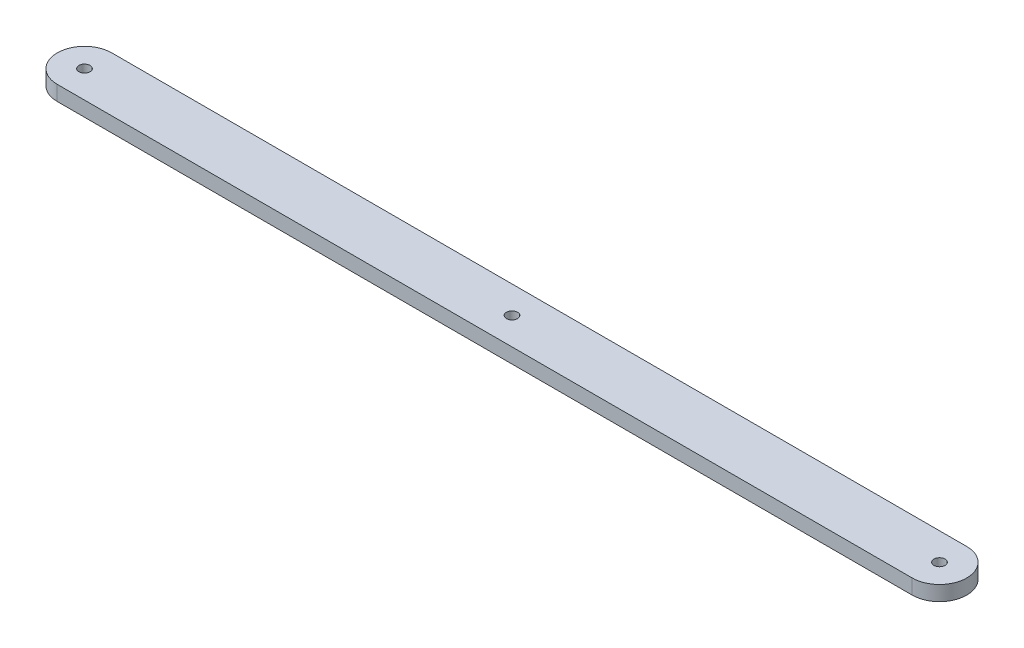
ISO-10303-21;
HEADER;
FILE_DESCRIPTION(('STEP AP214'),'2;1');
FILE_NAME('part.step','',(''),(''),'','','');
FILE_SCHEMA(('AUTOMOTIVE_DESIGN { 1 0 10303 214 1 1 1 1 }'));
ENDSEC;
DATA;
#1=APPLICATION_CONTEXT('core data for automotive mechanical design processes');
#2=APPLICATION_PROTOCOL_DEFINITION('international standard','automotive_design',2000,#1);
#3=PRODUCT_CONTEXT('',#1,'mechanical');
#4=PRODUCT('Part','Part','',(#3));
#5=PRODUCT_RELATED_PRODUCT_CATEGORY('part','',(#4));
#6=PRODUCT_DEFINITION_FORMATION('','',#4);
#7=PRODUCT_DEFINITION_CONTEXT('part definition',#1,'design');
#8=PRODUCT_DEFINITION('design','',#6,#7);
#9=PRODUCT_DEFINITION_SHAPE('','',#8);
#10=(LENGTH_UNIT() NAMED_UNIT(*) SI_UNIT(.MILLI.,.METRE.));
#11=(NAMED_UNIT(*) PLANE_ANGLE_UNIT() SI_UNIT($,.RADIAN.));
#12=(NAMED_UNIT(*) SI_UNIT($,.STERADIAN.) SOLID_ANGLE_UNIT());
#13=UNCERTAINTY_MEASURE_WITH_UNIT(LENGTH_MEASURE(1.E-05),#10,'distance_accuracy_value','');
#14=(GEOMETRIC_REPRESENTATION_CONTEXT(3) GLOBAL_UNCERTAINTY_ASSIGNED_CONTEXT((#13)) GLOBAL_UNIT_ASSIGNED_CONTEXT((#10,
#11,#12)) REPRESENTATION_CONTEXT('',''));
#15=CARTESIAN_POINT('',(0.,0.,0.));
#16=DIRECTION('',(0.,0.,1.));
#17=DIRECTION('',(1.,0.,0.));
#18=AXIS2_PLACEMENT_3D('',#15,#16,#17);
#19=CARTESIAN_POINT('',(0.,4.35,0.));
#20=DIRECTION('',(0.,1.,0.));
#21=DIRECTION('',(0.,0.,1.));
#22=AXIS2_PLACEMENT_3D('',#19,#20,#21);
#23=PLANE('',#22);
#24=CARTESIAN_POINT('',(125.,4.35,0.));
#25=DIRECTION('',(0.,1.,0.));
#26=DIRECTION('',(0.,0.,1.));
#27=AXIS2_PLACEMENT_3D('',#24,#25,#26);
#28=CIRCLE('',#27,1.625);
#29=CARTESIAN_POINT('',(125.,4.35,1.625));
#30=VERTEX_POINT('',#29);
#31=EDGE_CURVE('E117',#30,#30,#28,.T.);
#32=ORIENTED_EDGE('',*,*,#31,.F.);
#33=EDGE_LOOP('',(#32));
#34=FACE_BOUND('',#33,.T.);
#35=CARTESIAN_POINT('',(0.,4.35,0.));
#36=DIRECTION('',(0.,1.,0.));
#37=DIRECTION('',(0.,0.,1.));
#38=AXIS2_PLACEMENT_3D('',#35,#36,#37);
#39=CIRCLE('',#38,7.97347609683682);
#40=CARTESIAN_POINT('',(0.,4.35,-7.97347609683682));
#41=VERTEX_POINT('',#40);
#42=CARTESIAN_POINT('',(0.,4.35,7.97347609683682));
#43=VERTEX_POINT('',#42);
#44=EDGE_CURVE('E87',#41,#43,#39,.T.);
#45=ORIENTED_EDGE('',*,*,#44,.T.);
#46=DIRECTION('',(1.,0.,0.));
#47=VECTOR('',#46,1.);
#48=CARTESIAN_POINT('',(0.,4.35,7.97347609683682));
#49=LINE('',#48,#47);
#50=CARTESIAN_POINT('',(250.,4.35,7.97347609683682));
#51=VERTEX_POINT('',#50);
#52=EDGE_CURVE('E82',#43,#51,#49,.T.);
#53=ORIENTED_EDGE('',*,*,#52,.T.);
#54=CARTESIAN_POINT('',(250.,4.35,0.));
#55=DIRECTION('',(0.,1.,0.));
#56=DIRECTION('',(0.,0.,1.));
#57=AXIS2_PLACEMENT_3D('',#54,#55,#56);
#58=CIRCLE('',#57,7.97347609683682);
#59=CARTESIAN_POINT('',(250.,4.35,-7.97347609683682));
#60=VERTEX_POINT('',#59);
#61=EDGE_CURVE('E85',#51,#60,#58,.T.);
#62=ORIENTED_EDGE('',*,*,#61,.T.);
#63=DIRECTION('',(-1.,0.,0.));
#64=VECTOR('',#63,1.);
#65=CARTESIAN_POINT('',(0.,4.35,-7.97347609683682));
#66=LINE('',#65,#64);
#67=EDGE_CURVE('E52',#60,#41,#66,.T.);
#68=ORIENTED_EDGE('',*,*,#67,.T.);
#69=EDGE_LOOP('',(#45,#53,#62,#68));
#70=FACE_BOUND('',#69,.T.);
#71=CARTESIAN_POINT('',(250.,4.35,0.));
#72=DIRECTION('',(0.,1.,0.));
#73=DIRECTION('',(0.,0.,1.));
#74=AXIS2_PLACEMENT_3D('',#71,#72,#73);
#75=CIRCLE('',#74,1.62499999999998);
#76=CARTESIAN_POINT('',(250.,4.35,1.62499999999998));
#77=VERTEX_POINT('',#76);
#78=EDGE_CURVE('E102',#77,#77,#75,.T.);
#79=ORIENTED_EDGE('',*,*,#78,.F.);
#80=EDGE_LOOP('',(#79));
#81=FACE_BOUND('',#80,.T.);
#82=CARTESIAN_POINT('',(0.,4.35,0.));
#83=DIRECTION('',(0.,1.,0.));
#84=DIRECTION('',(0.,0.,1.));
#85=AXIS2_PLACEMENT_3D('',#82,#83,#84);
#86=CIRCLE('',#85,1.625);
#87=CARTESIAN_POINT('',(0.,4.35,1.625));
#88=VERTEX_POINT('',#87);
#89=EDGE_CURVE('E123',#88,#88,#86,.T.);
#90=ORIENTED_EDGE('',*,*,#89,.F.);
#91=EDGE_LOOP('',(#90));
#92=FACE_BOUND('',#91,.T.);
#93=ADVANCED_FACE('F35',(#34,#70,#81,#92),#23,.T.);
#94=CARTESIAN_POINT('',(0.,0.,0.));
#95=DIRECTION('',(0.,1.,0.));
#96=DIRECTION('',(0.,0.,1.));
#97=AXIS2_PLACEMENT_3D('',#94,#95,#96);
#98=PLANE('',#97);
#99=CARTESIAN_POINT('',(125.,0.,0.));
#100=DIRECTION('',(0.,1.,0.));
#101=DIRECTION('',(0.,0.,1.));
#102=AXIS2_PLACEMENT_3D('',#99,#100,#101);
#103=CIRCLE('',#102,1.625);
#104=CARTESIAN_POINT('',(125.,0.,1.625));
#105=VERTEX_POINT('',#104);
#106=EDGE_CURVE('E120',#105,#105,#103,.T.);
#107=ORIENTED_EDGE('',*,*,#106,.T.);
#108=EDGE_LOOP('',(#107));
#109=FACE_BOUND('',#108,.T.);
#110=CARTESIAN_POINT('',(0.,0.,0.));
#111=DIRECTION('',(0.,1.,0.));
#112=DIRECTION('',(0.,0.,1.));
#113=AXIS2_PLACEMENT_3D('',#110,#111,#112);
#114=CIRCLE('',#113,7.97347609683682);
#115=CARTESIAN_POINT('',(0.,0.,-7.97347609683682));
#116=VERTEX_POINT('',#115);
#117=CARTESIAN_POINT('',(0.,0.,7.97347609683682));
#118=VERTEX_POINT('',#117);
#119=EDGE_CURVE('E99',#116,#118,#114,.T.);
#120=ORIENTED_EDGE('',*,*,#119,.F.);
#121=DIRECTION('',(-1.,0.,0.));
#122=VECTOR('',#121,1.);
#123=CARTESIAN_POINT('',(0.,0.,-7.97347609683682));
#124=LINE('',#123,#122);
#125=CARTESIAN_POINT('',(250.,0.,-7.97347609683682));
#126=VERTEX_POINT('',#125);
#127=EDGE_CURVE('E75',#126,#116,#124,.T.);
#128=ORIENTED_EDGE('',*,*,#127,.F.);
#129=CARTESIAN_POINT('',(250.,0.,0.));
#130=DIRECTION('',(0.,1.,0.));
#131=DIRECTION('',(0.,0.,1.));
#132=AXIS2_PLACEMENT_3D('',#129,#130,#131);
#133=CIRCLE('',#132,7.97347609683682);
#134=CARTESIAN_POINT('',(250.,0.,7.97347609683682));
#135=VERTEX_POINT('',#134);
#136=EDGE_CURVE('E69',#135,#126,#133,.T.);
#137=ORIENTED_EDGE('',*,*,#136,.F.);
#138=DIRECTION('',(1.,0.,0.));
#139=VECTOR('',#138,1.);
#140=CARTESIAN_POINT('',(0.,0.,7.97347609683682));
#141=LINE('',#140,#139);
#142=EDGE_CURVE('E91',#118,#135,#141,.T.);
#143=ORIENTED_EDGE('',*,*,#142,.F.);
#144=EDGE_LOOP('',(#120,#128,#137,#143));
#145=FACE_BOUND('',#144,.T.);
#146=CARTESIAN_POINT('',(250.,0.,0.));
#147=DIRECTION('',(0.,1.,0.));
#148=DIRECTION('',(0.,0.,1.));
#149=AXIS2_PLACEMENT_3D('',#146,#147,#148);
#150=CIRCLE('',#149,1.62499999999998);
#151=CARTESIAN_POINT('',(250.,0.,1.62499999999998));
#152=VERTEX_POINT('',#151);
#153=EDGE_CURVE('E114',#152,#152,#150,.T.);
#154=ORIENTED_EDGE('',*,*,#153,.T.);
#155=EDGE_LOOP('',(#154));
#156=FACE_BOUND('',#155,.T.);
#157=CARTESIAN_POINT('',(0.,0.,0.));
#158=DIRECTION('',(0.,1.,0.));
#159=DIRECTION('',(0.,0.,1.));
#160=AXIS2_PLACEMENT_3D('',#157,#158,#159);
#161=CIRCLE('',#160,1.625);
#162=CARTESIAN_POINT('',(0.,0.,1.625));
#163=VERTEX_POINT('',#162);
#164=EDGE_CURVE('E126',#163,#163,#161,.T.);
#165=ORIENTED_EDGE('',*,*,#164,.T.);
#166=EDGE_LOOP('',(#165));
#167=FACE_BOUND('',#166,.T.);
#168=ADVANCED_FACE('F110',(#109,#145,#156,#167),#98,.F.);
#169=CARTESIAN_POINT('',(0.,4.35,0.));
#170=DIRECTION('',(0.,-1.,0.));
#171=DIRECTION('',(0.,0.,-1.));
#172=AXIS2_PLACEMENT_3D('',#169,#170,#171);
#173=CYLINDRICAL_SURFACE('',#172,7.97347609683682);
#174=ORIENTED_EDGE('',*,*,#119,.T.);
#175=DIRECTION('',(0.,-1.,0.));
#176=VECTOR('',#175,1.);
#177=CARTESIAN_POINT('',(0.,4.35,7.97347609683682));
#178=LINE('',#177,#176);
#179=EDGE_CURVE('E11',#43,#118,#178,.T.);
#180=ORIENTED_EDGE('',*,*,#179,.F.);
#181=ORIENTED_EDGE('',*,*,#44,.F.);
#182=DIRECTION('',(0.,-1.,0.));
#183=VECTOR('',#182,1.);
#184=CARTESIAN_POINT('',(0.,4.35,-7.97347609683682));
#185=LINE('',#184,#183);
#186=EDGE_CURVE('E95',#41,#116,#185,.T.);
#187=ORIENTED_EDGE('',*,*,#186,.T.);
#188=EDGE_LOOP('',(#174,#180,#181,#187));
#189=FACE_BOUND('',#188,.T.);
#190=ADVANCED_FACE('F37',(#189),#173,.T.);
#191=CARTESIAN_POINT('',(0.,4.35,7.97347609683682));
#192=DIRECTION('',(0.,0.,-1.));
#193=DIRECTION('',(-1.,0.,0.));
#194=AXIS2_PLACEMENT_3D('',#191,#192,#193);
#195=PLANE('',#194);
#196=ORIENTED_EDGE('',*,*,#142,.T.);
#197=DIRECTION('',(0.,-1.,0.));
#198=VECTOR('',#197,1.);
#199=CARTESIAN_POINT('',(250.,4.35,7.97347609683682));
#200=LINE('',#199,#198);
#201=EDGE_CURVE('E44',#51,#135,#200,.T.);
#202=ORIENTED_EDGE('',*,*,#201,.F.);
#203=ORIENTED_EDGE('',*,*,#52,.F.);
#204=ORIENTED_EDGE('',*,*,#179,.T.);
#205=EDGE_LOOP('',(#196,#202,#203,#204));
#206=FACE_BOUND('',#205,.T.);
#207=ADVANCED_FACE('F90',(#206),#195,.F.);
#208=CARTESIAN_POINT('',(250.,4.35,0.));
#209=DIRECTION('',(0.,-1.,0.));
#210=DIRECTION('',(0.,0.,-1.));
#211=AXIS2_PLACEMENT_3D('',#208,#209,#210);
#212=CYLINDRICAL_SURFACE('',#211,7.97347609683682);
#213=ORIENTED_EDGE('',*,*,#136,.T.);
#214=DIRECTION('',(0.,-1.,0.));
#215=VECTOR('',#214,1.);
#216=CARTESIAN_POINT('',(250.,4.35,-7.97347609683682));
#217=LINE('',#216,#215);
#218=EDGE_CURVE('E92',#60,#126,#217,.T.);
#219=ORIENTED_EDGE('',*,*,#218,.F.);
#220=ORIENTED_EDGE('',*,*,#61,.F.);
#221=ORIENTED_EDGE('',*,*,#201,.T.);
#222=EDGE_LOOP('',(#213,#219,#220,#221));
#223=FACE_BOUND('',#222,.T.);
#224=ADVANCED_FACE('F93',(#223),#212,.T.);
#225=CARTESIAN_POINT('',(0.,4.35,-7.97347609683682));
#226=DIRECTION('',(0.,0.,1.));
#227=DIRECTION('',(1.,0.,0.));
#228=AXIS2_PLACEMENT_3D('',#225,#226,#227);
#229=PLANE('',#228);
#230=ORIENTED_EDGE('',*,*,#127,.T.);
#231=ORIENTED_EDGE('',*,*,#186,.F.);
#232=ORIENTED_EDGE('',*,*,#67,.F.);
#233=ORIENTED_EDGE('',*,*,#218,.T.);
#234=EDGE_LOOP('',(#230,#231,#232,#233));
#235=FACE_BOUND('',#234,.T.);
#236=ADVANCED_FACE('F107',(#235),#229,.F.);
#237=CARTESIAN_POINT('',(250.,4.35,0.));
#238=DIRECTION('',(0.,-1.,0.));
#239=DIRECTION('',(0.,0.,-1.));
#240=AXIS2_PLACEMENT_3D('',#237,#238,#239);
#241=CYLINDRICAL_SURFACE('',#240,1.62499999999998);
#242=ORIENTED_EDGE('',*,*,#78,.T.);
#243=EDGE_LOOP('',(#242));
#244=FACE_BOUND('',#243,.T.);
#245=ORIENTED_EDGE('',*,*,#153,.F.);
#246=EDGE_LOOP('',(#245));
#247=FACE_BOUND('',#246,.T.);
#248=ADVANCED_FACE('F145',(#244,#247),#241,.F.);
#249=CARTESIAN_POINT('',(125.,4.35,0.));
#250=DIRECTION('',(0.,-1.,0.));
#251=DIRECTION('',(0.,0.,-1.));
#252=AXIS2_PLACEMENT_3D('',#249,#250,#251);
#253=CYLINDRICAL_SURFACE('',#252,1.625);
#254=ORIENTED_EDGE('',*,*,#31,.T.);
#255=EDGE_LOOP('',(#254));
#256=FACE_BOUND('',#255,.T.);
#257=ORIENTED_EDGE('',*,*,#106,.F.);
#258=EDGE_LOOP('',(#257));
#259=FACE_BOUND('',#258,.T.);
#260=ADVANCED_FACE('F191',(#256,#259),#253,.F.);
#261=CARTESIAN_POINT('',(0.,4.35,0.));
#262=DIRECTION('',(0.,-1.,0.));
#263=DIRECTION('',(0.,0.,-1.));
#264=AXIS2_PLACEMENT_3D('',#261,#262,#263);
#265=CYLINDRICAL_SURFACE('',#264,1.625);
#266=ORIENTED_EDGE('',*,*,#89,.T.);
#267=EDGE_LOOP('',(#266));
#268=FACE_BOUND('',#267,.T.);
#269=ORIENTED_EDGE('',*,*,#164,.F.);
#270=EDGE_LOOP('',(#269));
#271=FACE_BOUND('',#270,.T.);
#272=ADVANCED_FACE('F132',(#268,#271),#265,.F.);
#273=CLOSED_SHELL('',(#93,#168,#190,#207,#224,#236,#248,#260,#272));
#274=MANIFOLD_SOLID_BREP('B2',#273);
#275=ADVANCED_BREP_SHAPE_REPRESENTATION('',(#18,#274),#14);
#276=SHAPE_DEFINITION_REPRESENTATION(#9,#275);
ENDSEC;
END-ISO-10303-21;
